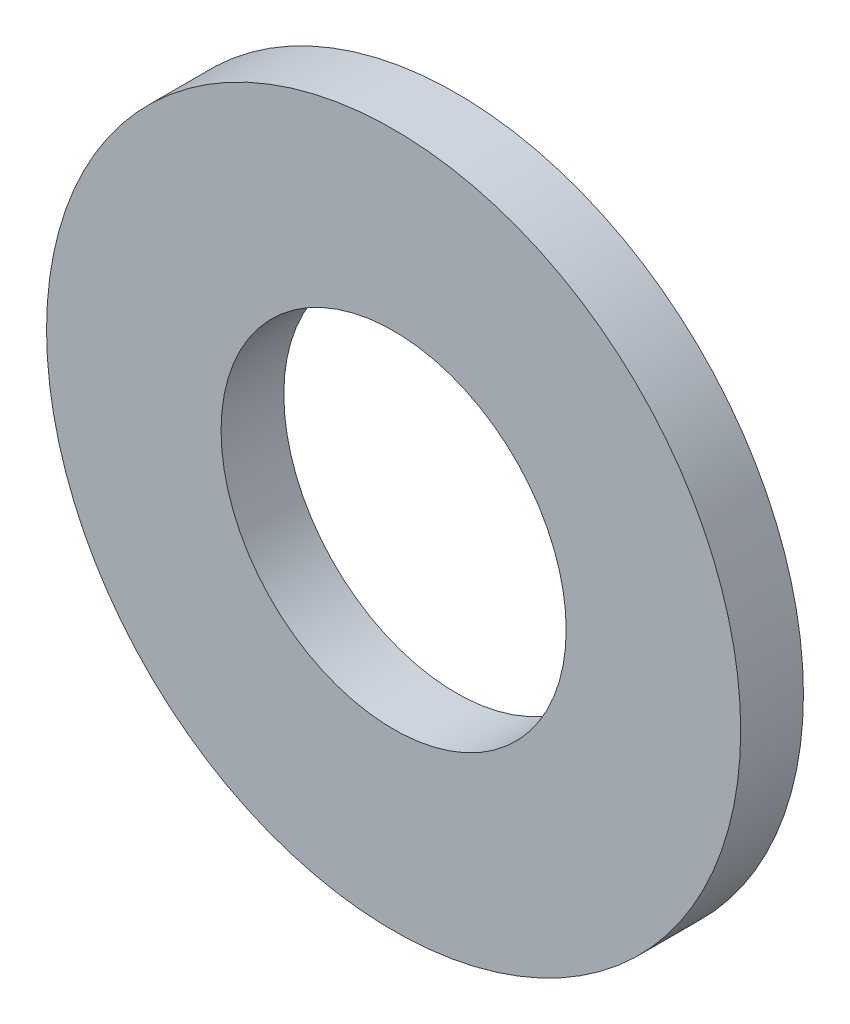
ISO-10303-21;
HEADER;
FILE_DESCRIPTION(('STEP AP214'),'2;1');
FILE_NAME('part.step','',(''),(''),'','','');
FILE_SCHEMA(('AUTOMOTIVE_DESIGN { 1 0 10303 214 1 1 1 1 }'));
ENDSEC;
DATA;
#1=APPLICATION_CONTEXT('core data for automotive mechanical design processes');
#2=APPLICATION_PROTOCOL_DEFINITION('international standard','automotive_design',2000,#1);
#3=PRODUCT_CONTEXT('',#1,'mechanical');
#4=PRODUCT('Part','Part','',(#3));
#5=PRODUCT_RELATED_PRODUCT_CATEGORY('part','',(#4));
#6=PRODUCT_DEFINITION_FORMATION('','',#4);
#7=PRODUCT_DEFINITION_CONTEXT('part definition',#1,'design');
#8=PRODUCT_DEFINITION('design','',#6,#7);
#9=PRODUCT_DEFINITION_SHAPE('','',#8);
#10=(LENGTH_UNIT() NAMED_UNIT(*) SI_UNIT(.MILLI.,.METRE.));
#11=(NAMED_UNIT(*) PLANE_ANGLE_UNIT() SI_UNIT($,.RADIAN.));
#12=(NAMED_UNIT(*) SI_UNIT($,.STERADIAN.) SOLID_ANGLE_UNIT());
#13=UNCERTAINTY_MEASURE_WITH_UNIT(LENGTH_MEASURE(1.E-05),#10,'distance_accuracy_value','');
#14=(GEOMETRIC_REPRESENTATION_CONTEXT(3) GLOBAL_UNCERTAINTY_ASSIGNED_CONTEXT((#13)) GLOBAL_UNIT_ASSIGNED_CONTEXT((#10,
#11,#12)) REPRESENTATION_CONTEXT('',''));
#15=CARTESIAN_POINT('',(0.,0.,0.));
#16=DIRECTION('',(0.,0.,1.));
#17=DIRECTION('',(1.,0.,0.));
#18=AXIS2_PLACEMENT_3D('',#15,#16,#17);
#19=CARTESIAN_POINT('',(0.,0.,0.8));
#20=DIRECTION('',(0.,0.,1.));
#21=DIRECTION('',(1.,0.,0.));
#22=AXIS2_PLACEMENT_3D('',#19,#20,#21);
#23=PLANE('',#22);
#24=CARTESIAN_POINT('',(0.,0.,0.8));
#25=DIRECTION('',(0.,0.,1.));
#26=DIRECTION('',(1.,0.,0.));
#27=AXIS2_PLACEMENT_3D('',#24,#25,#26);
#28=CIRCLE('',#27,4.425);
#29=CARTESIAN_POINT('',(4.425,0.,0.8));
#30=VERTEX_POINT('',#29);
#31=EDGE_CURVE('E10',#30,#30,#28,.T.);
#32=ORIENTED_EDGE('',*,*,#31,.T.);
#33=EDGE_LOOP('',(#32));
#34=FACE_BOUND('',#33,.T.);
#35=CARTESIAN_POINT('',(0.,0.,0.8));
#36=DIRECTION('',(0.,0.,1.));
#37=DIRECTION('',(1.,0.,0.));
#38=AXIS2_PLACEMENT_3D('',#35,#36,#37);
#39=CIRCLE('',#38,2.2);
#40=CARTESIAN_POINT('',(2.2,0.,0.8));
#41=VERTEX_POINT('',#40);
#42=EDGE_CURVE('E50',#41,#41,#39,.T.);
#43=ORIENTED_EDGE('',*,*,#42,.F.);
#44=EDGE_LOOP('',(#43));
#45=FACE_BOUND('',#44,.T.);
#46=ADVANCED_FACE('F39',(#34,#45),#23,.T.);
#47=CARTESIAN_POINT('',(0.,0.,0.));
#48=DIRECTION('',(0.,0.,1.));
#49=DIRECTION('',(1.,0.,0.));
#50=AXIS2_PLACEMENT_3D('',#47,#48,#49);
#51=PLANE('',#50);
#52=CARTESIAN_POINT('',(0.,0.,0.));
#53=DIRECTION('',(0.,0.,1.));
#54=DIRECTION('',(1.,0.,0.));
#55=AXIS2_PLACEMENT_3D('',#52,#53,#54);
#56=CIRCLE('',#55,4.425);
#57=CARTESIAN_POINT('',(4.425,0.,0.));
#58=VERTEX_POINT('',#57);
#59=EDGE_CURVE('E43',#58,#58,#56,.T.);
#60=ORIENTED_EDGE('',*,*,#59,.F.);
#61=EDGE_LOOP('',(#60));
#62=FACE_BOUND('',#61,.T.);
#63=CARTESIAN_POINT('',(0.,0.,0.));
#64=DIRECTION('',(0.,0.,1.));
#65=DIRECTION('',(1.,0.,0.));
#66=AXIS2_PLACEMENT_3D('',#63,#64,#65);
#67=CIRCLE('',#66,2.2);
#68=CARTESIAN_POINT('',(2.2,0.,0.));
#69=VERTEX_POINT('',#68);
#70=EDGE_CURVE('E52',#69,#69,#67,.T.);
#71=ORIENTED_EDGE('',*,*,#70,.T.);
#72=EDGE_LOOP('',(#71));
#73=FACE_BOUND('',#72,.T.);
#74=ADVANCED_FACE('F62',(#62,#73),#51,.F.);
#75=CARTESIAN_POINT('',(0.,0.,0.8));
#76=DIRECTION('',(0.,0.,-1.));
#77=DIRECTION('',(-1.,0.,0.));
#78=AXIS2_PLACEMENT_3D('',#75,#76,#77);
#79=CYLINDRICAL_SURFACE('',#78,4.425);
#80=ORIENTED_EDGE('',*,*,#31,.F.);
#81=EDGE_LOOP('',(#80));
#82=FACE_BOUND('',#81,.T.);
#83=ORIENTED_EDGE('',*,*,#59,.T.);
#84=EDGE_LOOP('',(#83));
#85=FACE_BOUND('',#84,.T.);
#86=ADVANCED_FACE('F41',(#82,#85),#79,.T.);
#87=CARTESIAN_POINT('',(0.,0.,0.8));
#88=DIRECTION('',(0.,0.,-1.));
#89=DIRECTION('',(-1.,0.,0.));
#90=AXIS2_PLACEMENT_3D('',#87,#88,#89);
#91=CYLINDRICAL_SURFACE('',#90,2.2);
#92=ORIENTED_EDGE('',*,*,#42,.T.);
#93=EDGE_LOOP('',(#92));
#94=FACE_BOUND('',#93,.T.);
#95=ORIENTED_EDGE('',*,*,#70,.F.);
#96=EDGE_LOOP('',(#95));
#97=FACE_BOUND('',#96,.T.);
#98=ADVANCED_FACE('F58',(#94,#97),#91,.F.);
#99=CLOSED_SHELL('',(#46,#74,#86,#98));
#100=MANIFOLD_SOLID_BREP('B2',#99);
#101=ADVANCED_BREP_SHAPE_REPRESENTATION('',(#18,#100),#14);
#102=SHAPE_DEFINITION_REPRESENTATION(#9,#101);
ENDSEC;
END-ISO-10303-21;
